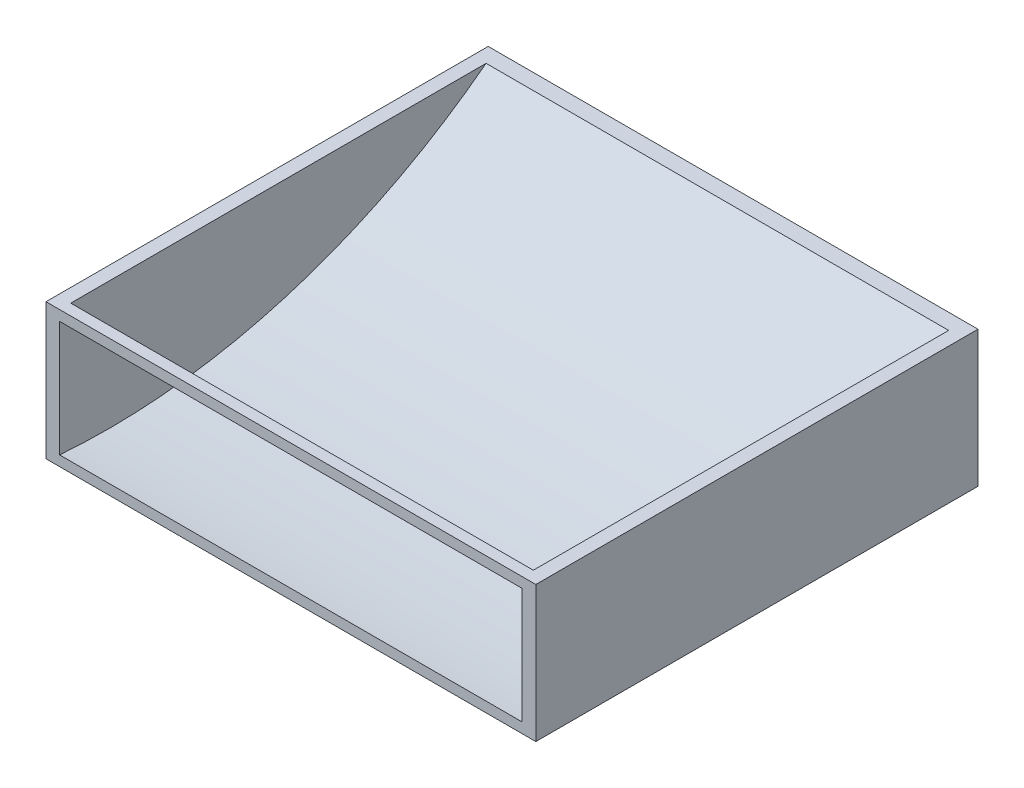
ISO-10303-21;
HEADER;
FILE_DESCRIPTION(('STEP AP214'),'2;1');
FILE_NAME('part.step','',(''),(''),'','','');
FILE_SCHEMA(('AUTOMOTIVE_DESIGN { 1 0 10303 214 1 1 1 1 }'));
ENDSEC;
DATA;
#1=APPLICATION_CONTEXT('core data for automotive mechanical design processes');
#2=APPLICATION_PROTOCOL_DEFINITION('international standard','automotive_design',2000,#1);
#3=PRODUCT_CONTEXT('',#1,'mechanical');
#4=PRODUCT('Part','Part','',(#3));
#5=PRODUCT_RELATED_PRODUCT_CATEGORY('part','',(#4));
#6=PRODUCT_DEFINITION_FORMATION('','',#4);
#7=PRODUCT_DEFINITION_CONTEXT('part definition',#1,'design');
#8=PRODUCT_DEFINITION('design','',#6,#7);
#9=PRODUCT_DEFINITION_SHAPE('','',#8);
#10=(LENGTH_UNIT() NAMED_UNIT(*) SI_UNIT(.MILLI.,.METRE.));
#11=(NAMED_UNIT(*) PLANE_ANGLE_UNIT() SI_UNIT($,.RADIAN.));
#12=(NAMED_UNIT(*) SI_UNIT($,.STERADIAN.) SOLID_ANGLE_UNIT());
#13=UNCERTAINTY_MEASURE_WITH_UNIT(LENGTH_MEASURE(1.E-05),#10,'distance_accuracy_value','');
#14=(GEOMETRIC_REPRESENTATION_CONTEXT(3) GLOBAL_UNCERTAINTY_ASSIGNED_CONTEXT((#13)) GLOBAL_UNIT_ASSIGNED_CONTEXT((#10,
#11,#12)) REPRESENTATION_CONTEXT('',''));
#15=CARTESIAN_POINT('',(0.,0.,0.));
#16=DIRECTION('',(0.,0.,1.));
#17=DIRECTION('',(1.,0.,0.));
#18=AXIS2_PLACEMENT_3D('',#15,#16,#17);
#19=CARTESIAN_POINT('',(-350.,-100.,-650.));
#20=DIRECTION('',(0.,-1.,0.));
#21=DIRECTION('',(0.,0.,-1.));
#22=AXIS2_PLACEMENT_3D('',#19,#20,#21);
#23=PLANE('',#22);
#24=DIRECTION('',(1.,0.,0.));
#25=VECTOR('',#24,1.);
#26=CARTESIAN_POINT('',(-350.,-100.,0.));
#27=LINE('',#26,#25);
#28=CARTESIAN_POINT('',(-350.,-100.,0.));
#29=VERTEX_POINT('',#28);
#30=CARTESIAN_POINT('',(370.,-100.,0.));
#31=VERTEX_POINT('',#30);
#32=EDGE_CURVE('E86',#29,#31,#27,.T.);
#33=ORIENTED_EDGE('',*,*,#32,.F.);
#34=DIRECTION('',(0.,0.,1.));
#35=VECTOR('',#34,1.);
#36=CARTESIAN_POINT('',(-350.,-100.,-650.));
#37=LINE('',#36,#35);
#38=CARTESIAN_POINT('',(-350.,-100.,-650.));
#39=VERTEX_POINT('',#38);
#40=EDGE_CURVE('E11',#39,#29,#37,.T.);
#41=ORIENTED_EDGE('',*,*,#40,.F.);
#42=DIRECTION('',(1.,0.,0.));
#43=VECTOR('',#42,1.);
#44=CARTESIAN_POINT('',(-350.,-100.,-650.));
#45=LINE('',#44,#43);
#46=CARTESIAN_POINT('',(370.,-100.,-650.));
#47=VERTEX_POINT('',#46);
#48=EDGE_CURVE('E105',#39,#47,#45,.T.);
#49=ORIENTED_EDGE('',*,*,#48,.T.);
#50=DIRECTION('',(0.,0.,-1.));
#51=VECTOR('',#50,1.);
#52=CARTESIAN_POINT('',(370.,-100.,0.));
#53=LINE('',#52,#51);
#54=EDGE_CURVE('E93',#31,#47,#53,.T.);
#55=ORIENTED_EDGE('',*,*,#54,.F.);
#56=EDGE_LOOP('',(#33,#41,#49,#55));
#57=FACE_BOUND('',#56,.T.);
#58=ADVANCED_FACE('F39',(#57),#23,.T.);
#59=CARTESIAN_POINT('',(-350.,100.,-650.));
#60=DIRECTION('',(-1.,0.,0.));
#61=DIRECTION('',(0.,0.,1.));
#62=AXIS2_PLACEMENT_3D('',#59,#60,#61);
#63=PLANE('',#62);
#64=DIRECTION('',(0.,-1.,0.));
#65=VECTOR('',#64,1.);
#66=CARTESIAN_POINT('',(-350.,100.,0.));
#67=LINE('',#66,#65);
#68=CARTESIAN_POINT('',(-350.,100.,0.));
#69=VERTEX_POINT('',#68);
#70=EDGE_CURVE('E76',#69,#29,#67,.T.);
#71=ORIENTED_EDGE('',*,*,#70,.F.);
#72=DIRECTION('',(0.,0.,1.));
#73=VECTOR('',#72,1.);
#74=CARTESIAN_POINT('',(-350.,100.,-650.));
#75=LINE('',#74,#73);
#76=CARTESIAN_POINT('',(-350.,100.,-650.));
#77=VERTEX_POINT('',#76);
#78=EDGE_CURVE('E43',#77,#69,#75,.T.);
#79=ORIENTED_EDGE('',*,*,#78,.F.);
#80=DIRECTION('',(0.,-1.,0.));
#81=VECTOR('',#80,1.);
#82=CARTESIAN_POINT('',(-350.,100.,-650.));
#83=LINE('',#82,#81);
#84=EDGE_CURVE('E79',#77,#39,#83,.T.);
#85=ORIENTED_EDGE('',*,*,#84,.T.);
#86=ORIENTED_EDGE('',*,*,#40,.T.);
#87=EDGE_LOOP('',(#71,#79,#85,#86));
#88=FACE_BOUND('',#87,.T.);
#89=ADVANCED_FACE('F75',(#88),#63,.T.);
#90=CARTESIAN_POINT('',(-350.,100.,-650.));
#91=DIRECTION('',(0.,1.,0.));
#92=DIRECTION('',(0.,0.,1.));
#93=AXIS2_PLACEMENT_3D('',#90,#91,#92);
#94=PLANE('',#93);
#95=DIRECTION('',(-1.,0.,0.));
#96=VECTOR('',#95,1.);
#97=CARTESIAN_POINT('',(-350.,100.,0.));
#98=LINE('',#97,#96);
#99=CARTESIAN_POINT('',(370.,99.9999999999998,0.));
#100=VERTEX_POINT('',#99);
#101=EDGE_CURVE('E89',#100,#69,#98,.T.);
#102=ORIENTED_EDGE('',*,*,#101,.F.);
#103=DIRECTION('',(0.,0.,1.));
#104=VECTOR('',#103,1.);
#105=CARTESIAN_POINT('',(370.,99.9999999999998,0.));
#106=LINE('',#105,#104);
#107=CARTESIAN_POINT('',(370.,100.,-650.));
#108=VERTEX_POINT('',#107);
#109=EDGE_CURVE('E135',#108,#100,#106,.T.);
#110=ORIENTED_EDGE('',*,*,#109,.F.);
#111=DIRECTION('',(-1.,0.,0.));
#112=VECTOR('',#111,1.);
#113=CARTESIAN_POINT('',(-350.,100.,-650.));
#114=LINE('',#113,#112);
#115=EDGE_CURVE('E96',#108,#77,#114,.T.);
#116=ORIENTED_EDGE('',*,*,#115,.T.);
#117=ORIENTED_EDGE('',*,*,#78,.T.);
#118=EDGE_LOOP('',(#102,#110,#116,#117));
#119=FACE_BOUND('',#118,.T.);
#120=DIRECTION('',(1.,0.,0.));
#121=VECTOR('',#120,1.);
#122=CARTESIAN_POINT('',(-330.,100.,-626.895433750743));
#123=LINE('',#122,#121);
#124=CARTESIAN_POINT('',(-330.,100.,-626.895433750743));
#125=VERTEX_POINT('',#124);
#126=CARTESIAN_POINT('',(350.,100.,-626.895433750743));
#127=VERTEX_POINT('',#126);
#128=EDGE_CURVE('E110',#125,#127,#123,.T.);
#129=ORIENTED_EDGE('',*,*,#128,.T.);
#130=DIRECTION('',(0.,0.,1.));
#131=VECTOR('',#130,1.);
#132=CARTESIAN_POINT('',(350.,99.9999999999998,0.));
#133=LINE('',#132,#131);
#134=CARTESIAN_POINT('',(350.,99.9999999999998,-16.3468837475685));
#135=VERTEX_POINT('',#134);
#136=EDGE_CURVE('E146',#127,#135,#133,.T.);
#137=ORIENTED_EDGE('',*,*,#136,.T.);
#138=DIRECTION('',(1.,0.,0.));
#139=VECTOR('',#138,1.);
#140=CARTESIAN_POINT('',(-330.,99.9999999999997,-16.3468837475685));
#141=LINE('',#140,#139);
#142=CARTESIAN_POINT('',(-330.,99.9999999999997,-16.3468837475685));
#143=VERTEX_POINT('',#142);
#144=EDGE_CURVE('E114',#143,#135,#141,.T.);
#145=ORIENTED_EDGE('',*,*,#144,.F.);
#146=DIRECTION('',(0.,0.,1.));
#147=VECTOR('',#146,1.);
#148=CARTESIAN_POINT('',(-330.,99.9999999999997,-16.3468837475685));
#149=LINE('',#148,#147);
#150=EDGE_CURVE('E140',#125,#143,#149,.T.);
#151=ORIENTED_EDGE('',*,*,#150,.F.);
#152=EDGE_LOOP('',(#129,#137,#145,#151));
#153=FACE_BOUND('',#152,.T.);
#154=ADVANCED_FACE('F41',(#119,#153),#94,.T.);
#155=CARTESIAN_POINT('',(0.,0.,-650.));
#156=DIRECTION('',(0.,0.,1.));
#157=DIRECTION('',(1.,0.,0.));
#158=AXIS2_PLACEMENT_3D('',#155,#156,#157);
#159=PLANE('',#158);
#160=ORIENTED_EDGE('',*,*,#115,.F.);
#161=DIRECTION('',(0.,1.,0.));
#162=VECTOR('',#161,1.);
#163=CARTESIAN_POINT('',(370.,100.,-650.));
#164=LINE('',#163,#162);
#165=EDGE_CURVE('E158',#47,#108,#164,.T.);
#166=ORIENTED_EDGE('',*,*,#165,.F.);
#167=ORIENTED_EDGE('',*,*,#48,.F.);
#168=ORIENTED_EDGE('',*,*,#84,.F.);
#169=EDGE_LOOP('',(#160,#166,#167,#168));
#170=FACE_BOUND('',#169,.T.);
#171=ADVANCED_FACE('F216',(#170),#159,.F.);
#172=CARTESIAN_POINT('',(0.,0.,0.));
#173=DIRECTION('',(0.,0.,1.));
#174=DIRECTION('',(1.,0.,0.));
#175=AXIS2_PLACEMENT_3D('',#172,#173,#174);
#176=PLANE('',#175);
#177=DIRECTION('',(0.,-1.,0.));
#178=VECTOR('',#177,1.);
#179=CARTESIAN_POINT('',(350.,99.9999999999998,0.));
#180=LINE('',#179,#178);
#181=CARTESIAN_POINT('',(350.,85.,0.));
#182=VERTEX_POINT('',#181);
#183=CARTESIAN_POINT('',(350.,-85.,0.));
#184=VERTEX_POINT('',#183);
#185=EDGE_CURVE('E151',#182,#184,#180,.T.);
#186=ORIENTED_EDGE('',*,*,#185,.T.);
#187=DIRECTION('',(1.,0.,0.));
#188=VECTOR('',#187,1.);
#189=CARTESIAN_POINT('',(-330.,-85.0000000000002,0.));
#190=LINE('',#189,#188);
#191=CARTESIAN_POINT('',(-330.,-85.0000000000002,0.));
#192=VERTEX_POINT('',#191);
#193=EDGE_CURVE('E104',#192,#184,#190,.T.);
#194=ORIENTED_EDGE('',*,*,#193,.F.);
#195=DIRECTION('',(0.,-1.,0.));
#196=VECTOR('',#195,1.);
#197=CARTESIAN_POINT('',(-330.,84.9999999999998,0.));
#198=LINE('',#197,#196);
#199=CARTESIAN_POINT('',(-330.,84.9999999999998,0.));
#200=VERTEX_POINT('',#199);
#201=EDGE_CURVE('E115',#200,#192,#198,.T.);
#202=ORIENTED_EDGE('',*,*,#201,.F.);
#203=DIRECTION('',(1.,0.,0.));
#204=VECTOR('',#203,1.);
#205=CARTESIAN_POINT('',(-330.,84.9999999999998,0.));
#206=LINE('',#205,#204);
#207=EDGE_CURVE('E119',#200,#182,#206,.T.);
#208=ORIENTED_EDGE('',*,*,#207,.T.);
#209=EDGE_LOOP('',(#186,#194,#202,#208));
#210=FACE_BOUND('',#209,.T.);
#211=ORIENTED_EDGE('',*,*,#32,.T.);
#212=DIRECTION('',(0.,-1.,0.));
#213=VECTOR('',#212,1.);
#214=CARTESIAN_POINT('',(370.,99.9999999999998,0.));
#215=LINE('',#214,#213);
#216=EDGE_CURVE('E150',#100,#31,#215,.T.);
#217=ORIENTED_EDGE('',*,*,#216,.F.);
#218=ORIENTED_EDGE('',*,*,#101,.T.);
#219=ORIENTED_EDGE('',*,*,#70,.T.);
#220=EDGE_LOOP('',(#211,#217,#218,#219));
#221=FACE_BOUND('',#220,.T.);
#222=ADVANCED_FACE('F83',(#210,#221),#176,.T.);
#223=CARTESIAN_POINT('',(-330.,824.451202346364,-72.3613023040864));
#224=DIRECTION('',(1.,0.,0.));
#225=DIRECTION('',(0.,1.,0.));
#226=AXIS2_PLACEMENT_3D('',#223,#224,#225);
#227=CYLINDRICAL_SURFACE('',#226,912.325406595909);
#228=CARTESIAN_POINT('',(350.,824.451202346364,-72.3613023040864));
#229=DIRECTION('',(1.,0.,0.));
#230=DIRECTION('',(0.,-1.,0.));
#231=AXIS2_PLACEMENT_3D('',#228,#229,#230);
#232=CIRCLE('',#231,912.325406595909);
#233=EDGE_CURVE('E131',#184,#127,#232,.T.);
#234=ORIENTED_EDGE('',*,*,#233,.T.);
#235=ORIENTED_EDGE('',*,*,#128,.F.);
#236=CARTESIAN_POINT('',(-330.,824.451202346364,-72.3613023040864));
#237=DIRECTION('',(1.,0.,0.));
#238=DIRECTION('',(0.,-1.,0.));
#239=AXIS2_PLACEMENT_3D('',#236,#237,#238);
#240=CIRCLE('',#239,912.325406595909);
#241=EDGE_CURVE('E130',#192,#125,#240,.T.);
#242=ORIENTED_EDGE('',*,*,#241,.F.);
#243=ORIENTED_EDGE('',*,*,#193,.T.);
#244=EDGE_LOOP('',(#234,#235,#242,#243));
#245=FACE_BOUND('',#244,.T.);
#246=ADVANCED_FACE('F208',(#245),#227,.F.);
#247=CARTESIAN_POINT('',(-330.,100.673441873784,-0.673441873784267));
#248=DIRECTION('',(1.,0.,0.));
#249=DIRECTION('',(0.,1.,0.));
#250=AXIS2_PLACEMENT_3D('',#247,#248,#249);
#251=CYLINDRICAL_SURFACE('',#250,15.6879031144465);
#252=CARTESIAN_POINT('',(350.,100.673441873784,-0.673441873784267));
#253=DIRECTION('',(-1.,0.,0.));
#254=DIRECTION('',(0.,-1.,0.));
#255=AXIS2_PLACEMENT_3D('',#252,#253,#254);
#256=CIRCLE('',#255,15.6879031144465);
#257=EDGE_CURVE('E126',#135,#182,#256,.T.);
#258=ORIENTED_EDGE('',*,*,#257,.T.);
#259=ORIENTED_EDGE('',*,*,#207,.F.);
#260=CARTESIAN_POINT('',(-330.,100.673441873784,-0.673441873784267));
#261=DIRECTION('',(-1.,0.,0.));
#262=DIRECTION('',(0.,-1.,0.));
#263=AXIS2_PLACEMENT_3D('',#260,#261,#262);
#264=CIRCLE('',#263,15.6879031144465);
#265=EDGE_CURVE('E55',#143,#200,#264,.T.);
#266=ORIENTED_EDGE('',*,*,#265,.F.);
#267=ORIENTED_EDGE('',*,*,#144,.T.);
#268=EDGE_LOOP('',(#258,#259,#266,#267));
#269=FACE_BOUND('',#268,.T.);
#270=ADVANCED_FACE('F201',(#269),#251,.T.);
#271=CARTESIAN_POINT('',(-330.,824.451202346364,-72.3613023040864));
#272=DIRECTION('',(-1.,0.,0.));
#273=DIRECTION('',(0.,-1.,0.));
#274=AXIS2_PLACEMENT_3D('',#271,#272,#273);
#275=PLANE('',#274);
#276=ORIENTED_EDGE('',*,*,#241,.T.);
#277=ORIENTED_EDGE('',*,*,#150,.T.);
#278=ORIENTED_EDGE('',*,*,#265,.T.);
#279=ORIENTED_EDGE('',*,*,#201,.T.);
#280=EDGE_LOOP('',(#276,#277,#278,#279));
#281=FACE_BOUND('',#280,.T.);
#282=ADVANCED_FACE('F204',(#281),#275,.F.);
#283=CARTESIAN_POINT('',(370.,1.02695629777827E-13,0.));
#284=DIRECTION('',(1.,0.,0.));
#285=DIRECTION('',(0.,1.,0.));
#286=AXIS2_PLACEMENT_3D('',#283,#284,#285);
#287=PLANE('',#286);
#288=ORIENTED_EDGE('',*,*,#216,.T.);
#289=ORIENTED_EDGE('',*,*,#54,.T.);
#290=ORIENTED_EDGE('',*,*,#165,.T.);
#291=ORIENTED_EDGE('',*,*,#109,.T.);
#292=EDGE_LOOP('',(#288,#289,#290,#291));
#293=FACE_BOUND('',#292,.T.);
#294=ADVANCED_FACE('F166',(#293),#287,.T.);
#295=CARTESIAN_POINT('',(350.,0.,0.));
#296=DIRECTION('',(1.,0.,0.));
#297=DIRECTION('',(0.,1.,0.));
#298=AXIS2_PLACEMENT_3D('',#295,#296,#297);
#299=PLANE('',#298);
#300=ORIENTED_EDGE('',*,*,#136,.F.);
#301=ORIENTED_EDGE('',*,*,#233,.F.);
#302=ORIENTED_EDGE('',*,*,#185,.F.);
#303=ORIENTED_EDGE('',*,*,#257,.F.);
#304=EDGE_LOOP('',(#300,#301,#302,#303));
#305=FACE_BOUND('',#304,.T.);
#306=ADVANCED_FACE('F197',(#305),#299,.F.);
#307=CLOSED_SHELL('',(#58,#89,#154,#171,#222,#246,#270,#282,#294,#306));
#308=MANIFOLD_SOLID_BREP('B2',#307);
#309=ADVANCED_BREP_SHAPE_REPRESENTATION('',(#18,#308),#14);
#310=SHAPE_DEFINITION_REPRESENTATION(#9,#309);
ENDSEC;
END-ISO-10303-21;
